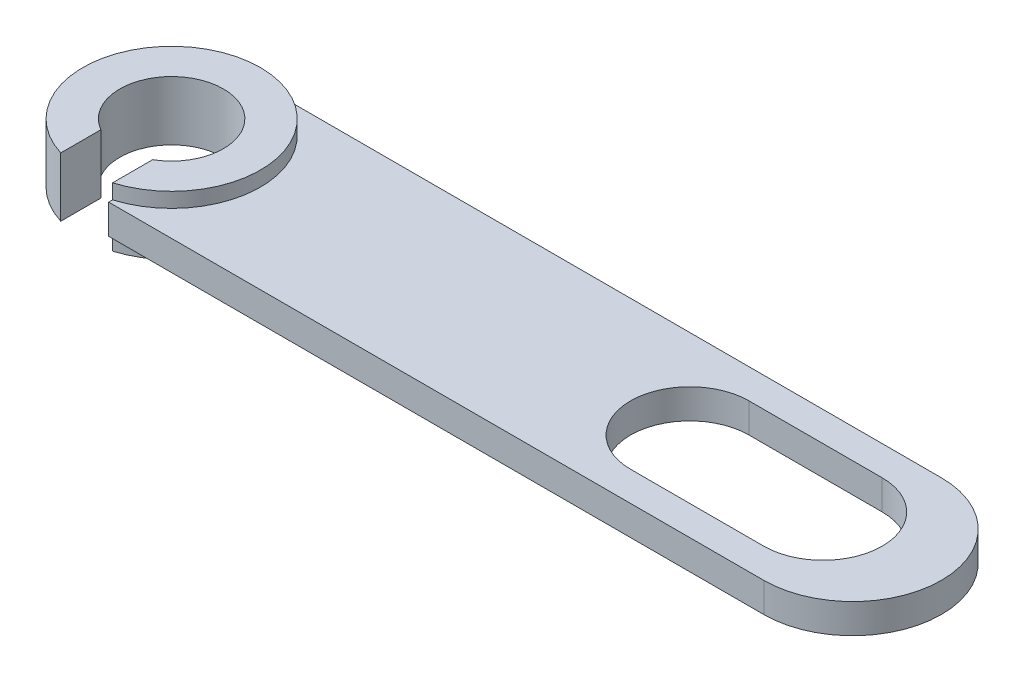
ISO-10303-21;
HEADER;
FILE_DESCRIPTION(('STEP AP214'),'2;1');
FILE_NAME('part.step','',(''),(''),'','','');
FILE_SCHEMA(('AUTOMOTIVE_DESIGN { 1 0 10303 214 1 1 1 1 }'));
ENDSEC;
DATA;
#1=APPLICATION_CONTEXT('core data for automotive mechanical design processes');
#2=APPLICATION_PROTOCOL_DEFINITION('international standard','automotive_design',2000,#1);
#3=PRODUCT_CONTEXT('',#1,'mechanical');
#4=PRODUCT('Part','Part','',(#3));
#5=PRODUCT_RELATED_PRODUCT_CATEGORY('part','',(#4));
#6=PRODUCT_DEFINITION_FORMATION('','',#4);
#7=PRODUCT_DEFINITION_CONTEXT('part definition',#1,'design');
#8=PRODUCT_DEFINITION('design','',#6,#7);
#9=PRODUCT_DEFINITION_SHAPE('','',#8);
#10=(LENGTH_UNIT() NAMED_UNIT(*) SI_UNIT(.MILLI.,.METRE.));
#11=(NAMED_UNIT(*) PLANE_ANGLE_UNIT() SI_UNIT($,.RADIAN.));
#12=(NAMED_UNIT(*) SI_UNIT($,.STERADIAN.) SOLID_ANGLE_UNIT());
#13=UNCERTAINTY_MEASURE_WITH_UNIT(LENGTH_MEASURE(1.E-05),#10,'distance_accuracy_value','');
#14=(GEOMETRIC_REPRESENTATION_CONTEXT(3) GLOBAL_UNCERTAINTY_ASSIGNED_CONTEXT((#13)) GLOBAL_UNIT_ASSIGNED_CONTEXT((#10,
#11,#12)) REPRESENTATION_CONTEXT('',''));
#15=CARTESIAN_POINT('',(0.,0.,0.));
#16=DIRECTION('',(0.,0.,1.));
#17=DIRECTION('',(1.,0.,0.));
#18=AXIS2_PLACEMENT_3D('',#15,#16,#17);
#19=CARTESIAN_POINT('',(-11.5,0.5,0.));
#20=DIRECTION('',(0.,1.,0.));
#21=DIRECTION('',(0.,0.,1.));
#22=AXIS2_PLACEMENT_3D('',#19,#20,#21);
#23=PLANE('',#22);
#24=DIRECTION('',(-1.,0.,0.));
#25=VECTOR('',#24,1.);
#26=CARTESIAN_POINT('',(10.5,0.5,-2.));
#27=LINE('',#26,#25);
#28=CARTESIAN_POINT('',(10.5,0.5,-2.));
#29=VERTEX_POINT('',#28);
#30=CARTESIAN_POINT('',(6.,0.5,-2.));
#31=VERTEX_POINT('',#30);
#32=EDGE_CURVE('E187',#29,#31,#27,.T.);
#33=ORIENTED_EDGE('',*,*,#32,.F.);
#34=CARTESIAN_POINT('',(10.5,0.5,0.));
#35=DIRECTION('',(0.,1.,0.));
#36=DIRECTION('',(0.,0.,1.));
#37=AXIS2_PLACEMENT_3D('',#34,#35,#36);
#38=CIRCLE('',#37,2.);
#39=CARTESIAN_POINT('',(10.5,0.5,2.));
#40=VERTEX_POINT('',#39);
#41=EDGE_CURVE('E185',#40,#29,#38,.T.);
#42=ORIENTED_EDGE('',*,*,#41,.F.);
#43=DIRECTION('',(1.,0.,0.));
#44=VECTOR('',#43,1.);
#45=CARTESIAN_POINT('',(10.5,0.5,2.));
#46=LINE('',#45,#44);
#47=CARTESIAN_POINT('',(6.00000000000001,0.5,2.));
#48=VERTEX_POINT('',#47);
#49=EDGE_CURVE('E192',#48,#40,#46,.T.);
#50=ORIENTED_EDGE('',*,*,#49,.F.);
#51=CARTESIAN_POINT('',(6.,0.5,0.));
#52=DIRECTION('',(0.,1.,0.));
#53=DIRECTION('',(0.,0.,1.));
#54=AXIS2_PLACEMENT_3D('',#51,#52,#53);
#55=CIRCLE('',#54,2.);
#56=EDGE_CURVE('E190',#31,#48,#55,.T.);
#57=ORIENTED_EDGE('',*,*,#56,.F.);
#58=EDGE_LOOP('',(#33,#42,#50,#57));
#59=FACE_BOUND('',#58,.T.);
#60=DIRECTION('',(-1.,0.,0.));
#61=VECTOR('',#60,1.);
#62=CARTESIAN_POINT('',(-11.5,0.5,-3.));
#63=LINE('',#62,#61);
#64=CARTESIAN_POINT('',(11.5,0.5,-3.));
#65=VERTEX_POINT('',#64);
#66=CARTESIAN_POINT('',(-11.5,0.5,-3.));
#67=VERTEX_POINT('',#66);
#68=EDGE_CURVE('E219',#65,#67,#63,.T.);
#69=ORIENTED_EDGE('',*,*,#68,.T.);
#70=CARTESIAN_POINT('',(-11.5,0.5,0.));
#71=DIRECTION('',(0.,1.,0.));
#72=DIRECTION('',(0.,0.,1.));
#73=AXIS2_PLACEMENT_3D('',#70,#71,#72);
#74=CIRCLE('',#73,3.);
#75=CARTESIAN_POINT('',(-10.625,0.5,2.86956007081225));
#76=VERTEX_POINT('',#75);
#77=EDGE_CURVE('E174',#67,#76,#74,.F.);
#78=ORIENTED_EDGE('',*,*,#77,.T.);
#79=DIRECTION('',(0.,0.,-1.));
#80=VECTOR('',#79,1.);
#81=CARTESIAN_POINT('',(-10.625,0.5,1.51554445662277));
#82=LINE('',#81,#80);
#83=CARTESIAN_POINT('',(-10.625,0.5,3.));
#84=VERTEX_POINT('',#83);
#85=EDGE_CURVE('E177',#84,#76,#82,.T.);
#86=ORIENTED_EDGE('',*,*,#85,.F.);
#87=DIRECTION('',(1.,0.,0.));
#88=VECTOR('',#87,1.);
#89=CARTESIAN_POINT('',(-11.5,0.5,3.));
#90=LINE('',#89,#88);
#91=CARTESIAN_POINT('',(11.5,0.5,3.));
#92=VERTEX_POINT('',#91);
#93=EDGE_CURVE('E214',#84,#92,#90,.T.);
#94=ORIENTED_EDGE('',*,*,#93,.T.);
#95=CARTESIAN_POINT('',(11.5,0.5,0.));
#96=DIRECTION('',(0.,1.,0.));
#97=DIRECTION('',(0.,0.,1.));
#98=AXIS2_PLACEMENT_3D('',#95,#96,#97);
#99=CIRCLE('',#98,3.);
#100=EDGE_CURVE('E216',#92,#65,#99,.T.);
#101=ORIENTED_EDGE('',*,*,#100,.T.);
#102=EDGE_LOOP('',(#69,#78,#86,#94,#101));
#103=FACE_BOUND('',#102,.T.);
#104=ADVANCED_FACE('F35',(#59,#103),#23,.T.);
#105=CARTESIAN_POINT('',(-11.5,-0.5,0.));
#106=DIRECTION('',(0.,1.,0.));
#107=DIRECTION('',(0.,0.,1.));
#108=AXIS2_PLACEMENT_3D('',#105,#106,#107);
#109=PLANE('',#108);
#110=CARTESIAN_POINT('',(10.5,-0.5,0.));
#111=DIRECTION('',(0.,1.,0.));
#112=DIRECTION('',(0.,0.,1.));
#113=AXIS2_PLACEMENT_3D('',#110,#111,#112);
#114=CIRCLE('',#113,2.);
#115=CARTESIAN_POINT('',(10.5,-0.5,2.));
#116=VERTEX_POINT('',#115);
#117=CARTESIAN_POINT('',(10.5,-0.5,-2.));
#118=VERTEX_POINT('',#117);
#119=EDGE_CURVE('E182',#116,#118,#114,.T.);
#120=ORIENTED_EDGE('',*,*,#119,.T.);
#121=DIRECTION('',(-1.,0.,0.));
#122=VECTOR('',#121,1.);
#123=CARTESIAN_POINT('',(10.5,-0.5,-2.));
#124=LINE('',#123,#122);
#125=CARTESIAN_POINT('',(6.,-0.5,-2.));
#126=VERTEX_POINT('',#125);
#127=EDGE_CURVE('E197',#118,#126,#124,.T.);
#128=ORIENTED_EDGE('',*,*,#127,.T.);
#129=CARTESIAN_POINT('',(6.,-0.5,0.));
#130=DIRECTION('',(0.,1.,0.));
#131=DIRECTION('',(0.,0.,1.));
#132=AXIS2_PLACEMENT_3D('',#129,#130,#131);
#133=CIRCLE('',#132,2.);
#134=CARTESIAN_POINT('',(6.,-0.5,2.));
#135=VERTEX_POINT('',#134);
#136=EDGE_CURVE('E200',#126,#135,#133,.T.);
#137=ORIENTED_EDGE('',*,*,#136,.T.);
#138=DIRECTION('',(1.,0.,0.));
#139=VECTOR('',#138,1.);
#140=CARTESIAN_POINT('',(10.5,-0.5,2.));
#141=LINE('',#140,#139);
#142=EDGE_CURVE('E188',#135,#116,#141,.T.);
#143=ORIENTED_EDGE('',*,*,#142,.T.);
#144=EDGE_LOOP('',(#120,#128,#137,#143));
#145=FACE_BOUND('',#144,.T.);
#146=CARTESIAN_POINT('',(-11.5,-0.5,0.));
#147=DIRECTION('',(0.,1.,0.));
#148=DIRECTION('',(0.,0.,1.));
#149=AXIS2_PLACEMENT_3D('',#146,#147,#148);
#150=CIRCLE('',#149,3.);
#151=CARTESIAN_POINT('',(-11.5,-0.5,-3.));
#152=VERTEX_POINT('',#151);
#153=CARTESIAN_POINT('',(-10.625,-0.5,2.86956007081225));
#154=VERTEX_POINT('',#153);
#155=EDGE_CURVE('E172',#152,#154,#150,.F.);
#156=ORIENTED_EDGE('',*,*,#155,.F.);
#157=DIRECTION('',(-1.,0.,0.));
#158=VECTOR('',#157,1.);
#159=CARTESIAN_POINT('',(-11.5,-0.5,-3.));
#160=LINE('',#159,#158);
#161=CARTESIAN_POINT('',(11.5,-0.5,-3.));
#162=VERTEX_POINT('',#161);
#163=EDGE_CURVE('E217',#162,#152,#160,.T.);
#164=ORIENTED_EDGE('',*,*,#163,.F.);
#165=CARTESIAN_POINT('',(11.5,-0.5,0.));
#166=DIRECTION('',(0.,1.,0.));
#167=DIRECTION('',(0.,0.,1.));
#168=AXIS2_PLACEMENT_3D('',#165,#166,#167);
#169=CIRCLE('',#168,3.);
#170=CARTESIAN_POINT('',(11.5,-0.5,3.));
#171=VERTEX_POINT('',#170);
#172=EDGE_CURVE('E224',#171,#162,#169,.T.);
#173=ORIENTED_EDGE('',*,*,#172,.F.);
#174=DIRECTION('',(1.,0.,0.));
#175=VECTOR('',#174,1.);
#176=CARTESIAN_POINT('',(-11.5,-0.5,3.));
#177=LINE('',#176,#175);
#178=CARTESIAN_POINT('',(-10.625,-0.5,3.));
#179=VERTEX_POINT('',#178);
#180=EDGE_CURVE('E213',#179,#171,#177,.T.);
#181=ORIENTED_EDGE('',*,*,#180,.F.);
#182=DIRECTION('',(0.,0.,-1.));
#183=VECTOR('',#182,1.);
#184=CARTESIAN_POINT('',(-10.625,-0.5,1.51554445662277));
#185=LINE('',#184,#183);
#186=EDGE_CURVE('E50',#179,#154,#185,.T.);
#187=ORIENTED_EDGE('',*,*,#186,.T.);
#188=EDGE_LOOP('',(#156,#164,#173,#181,#187));
#189=FACE_BOUND('',#188,.T.);
#190=ADVANCED_FACE('F239',(#145,#189),#109,.F.);
#191=CARTESIAN_POINT('',(-11.5,0.5,0.));
#192=DIRECTION('',(0.,-1.,0.));
#193=DIRECTION('',(0.,0.,-1.));
#194=AXIS2_PLACEMENT_3D('',#191,#192,#193);
#195=CYLINDRICAL_SURFACE('',#194,3.);
#196=DIRECTION('',(0.,-1.,0.));
#197=VECTOR('',#196,1.);
#198=CARTESIAN_POINT('',(-11.5,0.5,-3.));
#199=LINE('',#198,#197);
#200=EDGE_CURVE('E222',#67,#152,#199,.T.);
#201=ORIENTED_EDGE('',*,*,#200,.T.);
#202=ORIENTED_EDGE('',*,*,#155,.T.);
#203=DIRECTION('',(0.,-1.,0.));
#204=VECTOR('',#203,1.);
#205=CARTESIAN_POINT('',(-10.625,1.,2.86956007081225));
#206=LINE('',#205,#204);
#207=CARTESIAN_POINT('',(-10.625,-1.,2.86956007081225));
#208=VERTEX_POINT('',#207);
#209=EDGE_CURVE('E165',#154,#208,#206,.T.);
#210=ORIENTED_EDGE('',*,*,#209,.T.);
#211=CARTESIAN_POINT('',(-11.5,-1.,0.));
#212=DIRECTION('',(0.,1.,0.));
#213=DIRECTION('',(0.,0.,1.));
#214=AXIS2_PLACEMENT_3D('',#211,#212,#213);
#215=CIRCLE('',#214,3.);
#216=CARTESIAN_POINT('',(-12.375,-1.,2.86956007081225));
#217=VERTEX_POINT('',#216);
#218=EDGE_CURVE('E160',#208,#217,#215,.T.);
#219=ORIENTED_EDGE('',*,*,#218,.T.);
#220=DIRECTION('',(0.,1.,0.));
#221=VECTOR('',#220,1.);
#222=CARTESIAN_POINT('',(-12.375,-0.5,2.86956007081225));
#223=LINE('',#222,#221);
#224=CARTESIAN_POINT('',(-12.375,1.,2.86956007081225));
#225=VERTEX_POINT('',#224);
#226=EDGE_CURVE('E180',#217,#225,#223,.T.);
#227=ORIENTED_EDGE('',*,*,#226,.T.);
#228=CARTESIAN_POINT('',(-11.5,1.,0.));
#229=DIRECTION('',(0.,1.,0.));
#230=DIRECTION('',(0.,0.,1.));
#231=AXIS2_PLACEMENT_3D('',#228,#229,#230);
#232=CIRCLE('',#231,3.);
#233=CARTESIAN_POINT('',(-10.625,1.,2.86956007081225));
#234=VERTEX_POINT('',#233);
#235=EDGE_CURVE('E151',#234,#225,#232,.T.);
#236=ORIENTED_EDGE('',*,*,#235,.F.);
#237=EDGE_CURVE('E147',#234,#76,#206,.T.);
#238=ORIENTED_EDGE('',*,*,#237,.T.);
#239=ORIENTED_EDGE('',*,*,#77,.F.);
#240=EDGE_LOOP('',(#201,#202,#210,#219,#227,#236,#238,#239));
#241=FACE_BOUND('',#240,.T.);
#242=ADVANCED_FACE('F37',(#241),#195,.T.);
#243=CARTESIAN_POINT('',(-11.5,0.5,3.));
#244=DIRECTION('',(0.,0.,-1.));
#245=DIRECTION('',(-1.,0.,0.));
#246=AXIS2_PLACEMENT_3D('',#243,#244,#245);
#247=PLANE('',#246);
#248=ORIENTED_EDGE('',*,*,#93,.F.);
#249=DIRECTION('',(0.,1.,0.));
#250=VECTOR('',#249,1.);
#251=CARTESIAN_POINT('',(-10.625,-0.5,3.));
#252=LINE('',#251,#250);
#253=EDGE_CURVE('E141',#179,#84,#252,.T.);
#254=ORIENTED_EDGE('',*,*,#253,.F.);
#255=ORIENTED_EDGE('',*,*,#180,.T.);
#256=DIRECTION('',(0.,-1.,0.));
#257=VECTOR('',#256,1.);
#258=CARTESIAN_POINT('',(11.5,0.5,3.));
#259=LINE('',#258,#257);
#260=EDGE_CURVE('E11',#92,#171,#259,.T.);
#261=ORIENTED_EDGE('',*,*,#260,.F.);
#262=EDGE_LOOP('',(#248,#254,#255,#261));
#263=FACE_BOUND('',#262,.T.);
#264=ADVANCED_FACE('F275',(#263),#247,.F.);
#265=CARTESIAN_POINT('',(11.5,0.5,0.));
#266=DIRECTION('',(0.,-1.,0.));
#267=DIRECTION('',(0.,0.,-1.));
#268=AXIS2_PLACEMENT_3D('',#265,#266,#267);
#269=CYLINDRICAL_SURFACE('',#268,3.);
#270=ORIENTED_EDGE('',*,*,#172,.T.);
#271=DIRECTION('',(0.,-1.,0.));
#272=VECTOR('',#271,1.);
#273=CARTESIAN_POINT('',(11.5,0.5,-3.));
#274=LINE('',#273,#272);
#275=EDGE_CURVE('E43',#65,#162,#274,.T.);
#276=ORIENTED_EDGE('',*,*,#275,.F.);
#277=ORIENTED_EDGE('',*,*,#100,.F.);
#278=ORIENTED_EDGE('',*,*,#260,.T.);
#279=EDGE_LOOP('',(#270,#276,#277,#278));
#280=FACE_BOUND('',#279,.T.);
#281=ADVANCED_FACE('F273',(#280),#269,.T.);
#282=CARTESIAN_POINT('',(-11.5,0.5,-3.));
#283=DIRECTION('',(0.,0.,1.));
#284=DIRECTION('',(1.,0.,0.));
#285=AXIS2_PLACEMENT_3D('',#282,#283,#284);
#286=PLANE('',#285);
#287=ORIENTED_EDGE('',*,*,#163,.T.);
#288=ORIENTED_EDGE('',*,*,#200,.F.);
#289=ORIENTED_EDGE('',*,*,#68,.F.);
#290=ORIENTED_EDGE('',*,*,#275,.T.);
#291=EDGE_LOOP('',(#287,#288,#289,#290));
#292=FACE_BOUND('',#291,.T.);
#293=ADVANCED_FACE('F234',(#292),#286,.F.);
#294=CARTESIAN_POINT('',(10.5,0.5,0.));
#295=DIRECTION('',(0.,-1.,0.));
#296=DIRECTION('',(0.,0.,-1.));
#297=AXIS2_PLACEMENT_3D('',#294,#295,#296);
#298=CYLINDRICAL_SURFACE('',#297,2.);
#299=ORIENTED_EDGE('',*,*,#119,.F.);
#300=DIRECTION('',(0.,-1.,0.));
#301=VECTOR('',#300,1.);
#302=CARTESIAN_POINT('',(10.5,0.5,2.));
#303=LINE('',#302,#301);
#304=EDGE_CURVE('E194',#40,#116,#303,.T.);
#305=ORIENTED_EDGE('',*,*,#304,.F.);
#306=ORIENTED_EDGE('',*,*,#41,.T.);
#307=DIRECTION('',(0.,-1.,0.));
#308=VECTOR('',#307,1.);
#309=CARTESIAN_POINT('',(10.5,0.5,-2.));
#310=LINE('',#309,#308);
#311=EDGE_CURVE('E210',#29,#118,#310,.T.);
#312=ORIENTED_EDGE('',*,*,#311,.T.);
#313=EDGE_LOOP('',(#299,#305,#306,#312));
#314=FACE_BOUND('',#313,.T.);
#315=ADVANCED_FACE('F268',(#314),#298,.F.);
#316=CARTESIAN_POINT('',(10.5,0.5,-2.));
#317=DIRECTION('',(0.,0.,1.));
#318=DIRECTION('',(1.,0.,0.));
#319=AXIS2_PLACEMENT_3D('',#316,#317,#318);
#320=PLANE('',#319);
#321=ORIENTED_EDGE('',*,*,#127,.F.);
#322=ORIENTED_EDGE('',*,*,#311,.F.);
#323=ORIENTED_EDGE('',*,*,#32,.T.);
#324=DIRECTION('',(0.,-1.,0.));
#325=VECTOR('',#324,1.);
#326=CARTESIAN_POINT('',(6.,0.5,-2.));
#327=LINE('',#326,#325);
#328=EDGE_CURVE('E208',#31,#126,#327,.T.);
#329=ORIENTED_EDGE('',*,*,#328,.T.);
#330=EDGE_LOOP('',(#321,#322,#323,#329));
#331=FACE_BOUND('',#330,.T.);
#332=ADVANCED_FACE('F323',(#331),#320,.T.);
#333=CARTESIAN_POINT('',(6.,0.5,0.));
#334=DIRECTION('',(0.,-1.,0.));
#335=DIRECTION('',(0.,0.,-1.));
#336=AXIS2_PLACEMENT_3D('',#333,#334,#335);
#337=CYLINDRICAL_SURFACE('',#336,2.);
#338=ORIENTED_EDGE('',*,*,#136,.F.);
#339=ORIENTED_EDGE('',*,*,#328,.F.);
#340=ORIENTED_EDGE('',*,*,#56,.T.);
#341=DIRECTION('',(0.,-1.,0.));
#342=VECTOR('',#341,1.);
#343=CARTESIAN_POINT('',(6.,0.5,2.));
#344=LINE('',#343,#342);
#345=EDGE_CURVE('E58',#48,#135,#344,.T.);
#346=ORIENTED_EDGE('',*,*,#345,.T.);
#347=EDGE_LOOP('',(#338,#339,#340,#346));
#348=FACE_BOUND('',#347,.T.);
#349=ADVANCED_FACE('F312',(#348),#337,.F.);
#350=CARTESIAN_POINT('',(10.5,0.5,2.));
#351=DIRECTION('',(0.,0.,-1.));
#352=DIRECTION('',(-1.,0.,0.));
#353=AXIS2_PLACEMENT_3D('',#350,#351,#352);
#354=PLANE('',#353);
#355=ORIENTED_EDGE('',*,*,#142,.F.);
#356=ORIENTED_EDGE('',*,*,#345,.F.);
#357=ORIENTED_EDGE('',*,*,#49,.T.);
#358=ORIENTED_EDGE('',*,*,#304,.T.);
#359=EDGE_LOOP('',(#355,#356,#357,#358));
#360=FACE_BOUND('',#359,.T.);
#361=ADVANCED_FACE('F307',(#360),#354,.T.);
#362=CARTESIAN_POINT('',(-11.5,0.5,0.));
#363=DIRECTION('',(0.,-1.,0.));
#364=DIRECTION('',(0.,0.,-1.));
#365=AXIS2_PLACEMENT_3D('',#362,#363,#364);
#366=CYLINDRICAL_SURFACE('',#365,1.75);
#367=DIRECTION('',(0.,1.,0.));
#368=VECTOR('',#367,1.);
#369=CARTESIAN_POINT('',(-12.375,-0.5,1.51554445662277));
#370=LINE('',#369,#368);
#371=CARTESIAN_POINT('',(-12.375,-1.,1.51554445662277));
#372=VERTEX_POINT('',#371);
#373=CARTESIAN_POINT('',(-12.375,1.,1.51554445662277));
#374=VERTEX_POINT('',#373);
#375=EDGE_CURVE('E140',#372,#374,#370,.T.);
#376=ORIENTED_EDGE('',*,*,#375,.F.);
#377=CARTESIAN_POINT('',(-11.5,-1.,0.));
#378=DIRECTION('',(0.,-1.,0.));
#379=DIRECTION('',(0.,0.,1.));
#380=AXIS2_PLACEMENT_3D('',#377,#378,#379);
#381=CIRCLE('',#380,1.75);
#382=CARTESIAN_POINT('',(-10.625,-1.,1.51554445662277));
#383=VERTEX_POINT('',#382);
#384=EDGE_CURVE('E136',#372,#383,#381,.T.);
#385=ORIENTED_EDGE('',*,*,#384,.T.);
#386=DIRECTION('',(0.,1.,0.));
#387=VECTOR('',#386,1.);
#388=CARTESIAN_POINT('',(-10.625,-0.5,1.51554445662277));
#389=LINE('',#388,#387);
#390=CARTESIAN_POINT('',(-10.625,1.,1.51554445662277));
#391=VERTEX_POINT('',#390);
#392=EDGE_CURVE('E130',#383,#391,#389,.T.);
#393=ORIENTED_EDGE('',*,*,#392,.T.);
#394=CARTESIAN_POINT('',(-11.5,1.,0.));
#395=DIRECTION('',(0.,-1.,0.));
#396=DIRECTION('',(0.,0.,1.));
#397=AXIS2_PLACEMENT_3D('',#394,#395,#396);
#398=CIRCLE('',#397,1.75);
#399=EDGE_CURVE('E134',#374,#391,#398,.T.);
#400=ORIENTED_EDGE('',*,*,#399,.F.);
#401=EDGE_LOOP('',(#376,#385,#393,#400));
#402=FACE_BOUND('',#401,.T.);
#403=ADVANCED_FACE('F132',(#402),#366,.F.);
#404=CARTESIAN_POINT('',(-10.625,-0.5,1.51554445662277));
#405=DIRECTION('',(1.,0.,0.));
#406=DIRECTION('',(0.,0.,-1.));
#407=AXIS2_PLACEMENT_3D('',#404,#405,#406);
#408=PLANE('',#407);
#409=ORIENTED_EDGE('',*,*,#392,.F.);
#410=DIRECTION('',(0.,0.,1.));
#411=VECTOR('',#410,1.);
#412=CARTESIAN_POINT('',(-10.625,-1.,2.86956007081225));
#413=LINE('',#412,#411);
#414=EDGE_CURVE('E167',#383,#208,#413,.T.);
#415=ORIENTED_EDGE('',*,*,#414,.T.);
#416=ORIENTED_EDGE('',*,*,#209,.F.);
#417=ORIENTED_EDGE('',*,*,#186,.F.);
#418=ORIENTED_EDGE('',*,*,#253,.T.);
#419=ORIENTED_EDGE('',*,*,#85,.T.);
#420=ORIENTED_EDGE('',*,*,#237,.F.);
#421=DIRECTION('',(0.,0.,1.));
#422=VECTOR('',#421,1.);
#423=CARTESIAN_POINT('',(-10.625,1.,2.86956007081225));
#424=LINE('',#423,#422);
#425=EDGE_CURVE('E144',#391,#234,#424,.T.);
#426=ORIENTED_EDGE('',*,*,#425,.F.);
#427=EDGE_LOOP('',(#409,#415,#416,#417,#418,#419,#420,#426));
#428=FACE_BOUND('',#427,.T.);
#429=ADVANCED_FACE('F145',(#428),#408,.F.);
#430=CARTESIAN_POINT('',(-12.375,-0.5,1.51554445662277));
#431=DIRECTION('',(-1.,0.,0.));
#432=DIRECTION('',(0.,0.,1.));
#433=AXIS2_PLACEMENT_3D('',#430,#431,#432);
#434=PLANE('',#433);
#435=ORIENTED_EDGE('',*,*,#226,.F.);
#436=DIRECTION('',(0.,0.,-1.));
#437=VECTOR('',#436,1.);
#438=CARTESIAN_POINT('',(-12.375,-1.,1.51554445662277));
#439=LINE('',#438,#437);
#440=EDGE_CURVE('E157',#217,#372,#439,.T.);
#441=ORIENTED_EDGE('',*,*,#440,.T.);
#442=ORIENTED_EDGE('',*,*,#375,.T.);
#443=DIRECTION('',(0.,0.,-1.));
#444=VECTOR('',#443,1.);
#445=CARTESIAN_POINT('',(-12.375,1.,1.51554445662277));
#446=LINE('',#445,#444);
#447=EDGE_CURVE('E156',#225,#374,#446,.T.);
#448=ORIENTED_EDGE('',*,*,#447,.F.);
#449=EDGE_LOOP('',(#435,#441,#442,#448));
#450=FACE_BOUND('',#449,.T.);
#451=ADVANCED_FACE('F248',(#450),#434,.F.);
#452=CARTESIAN_POINT('',(-11.5,-1.,0.));
#453=DIRECTION('',(0.,1.,0.));
#454=DIRECTION('',(0.,0.,1.));
#455=AXIS2_PLACEMENT_3D('',#452,#453,#454);
#456=PLANE('',#455);
#457=ORIENTED_EDGE('',*,*,#384,.F.);
#458=ORIENTED_EDGE('',*,*,#440,.F.);
#459=ORIENTED_EDGE('',*,*,#218,.F.);
#460=ORIENTED_EDGE('',*,*,#414,.F.);
#461=EDGE_LOOP('',(#457,#458,#459,#460));
#462=FACE_BOUND('',#461,.T.);
#463=ADVANCED_FACE('F246',(#462),#456,.F.);
#464=CARTESIAN_POINT('',(-11.5,1.,0.));
#465=DIRECTION('',(0.,1.,0.));
#466=DIRECTION('',(0.,0.,1.));
#467=AXIS2_PLACEMENT_3D('',#464,#465,#466);
#468=PLANE('',#467);
#469=ORIENTED_EDGE('',*,*,#399,.T.);
#470=ORIENTED_EDGE('',*,*,#425,.T.);
#471=ORIENTED_EDGE('',*,*,#235,.T.);
#472=ORIENTED_EDGE('',*,*,#447,.T.);
#473=EDGE_LOOP('',(#469,#470,#471,#472));
#474=FACE_BOUND('',#473,.T.);
#475=ADVANCED_FACE('F154',(#474),#468,.T.);
#476=CLOSED_SHELL('',(#104,#190,#242,#264,#281,#293,#315,#332,#349,#361,#403,#429,#451,#463,#475));
#477=MANIFOLD_SOLID_BREP('B2',#476);
#478=ADVANCED_BREP_SHAPE_REPRESENTATION('',(#18,#477),#14);
#479=SHAPE_DEFINITION_REPRESENTATION(#9,#478);
ENDSEC;
END-ISO-10303-21;
